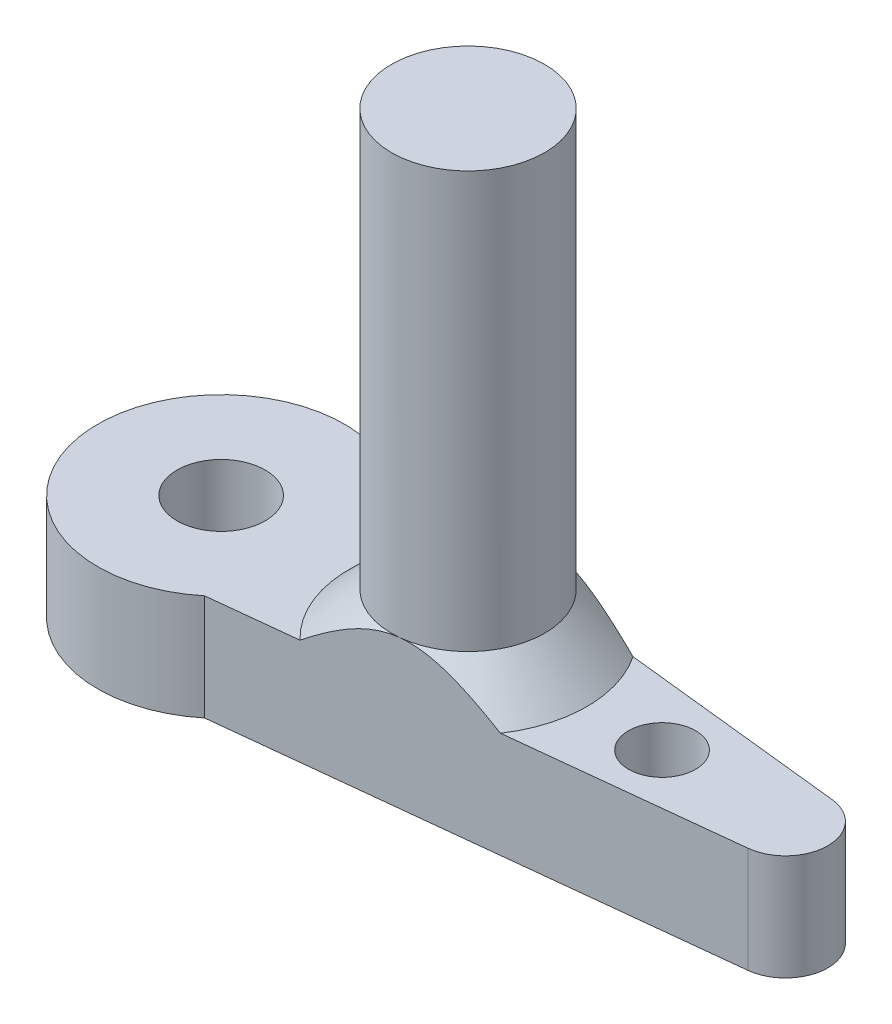
ISO-10303-21;
HEADER;
FILE_DESCRIPTION(('STEP AP214'),'2;1');
FILE_NAME('part.step','',(''),(''),'','','');
FILE_SCHEMA(('AUTOMOTIVE_DESIGN { 1 0 10303 214 1 1 1 1 }'));
ENDSEC;
DATA;
#1=APPLICATION_CONTEXT('core data for automotive mechanical design processes');
#2=APPLICATION_PROTOCOL_DEFINITION('international standard','automotive_design',2000,#1);
#3=PRODUCT_CONTEXT('',#1,'mechanical');
#4=PRODUCT('Part','Part','',(#3));
#5=PRODUCT_RELATED_PRODUCT_CATEGORY('part','',(#4));
#6=PRODUCT_DEFINITION_FORMATION('','',#4);
#7=PRODUCT_DEFINITION_CONTEXT('part definition',#1,'design');
#8=PRODUCT_DEFINITION('design','',#6,#7);
#9=PRODUCT_DEFINITION_SHAPE('','',#8);
#10=(LENGTH_UNIT() NAMED_UNIT(*) SI_UNIT(.MILLI.,.METRE.));
#11=(NAMED_UNIT(*) PLANE_ANGLE_UNIT() SI_UNIT($,.RADIAN.));
#12=(NAMED_UNIT(*) SI_UNIT($,.STERADIAN.) SOLID_ANGLE_UNIT());
#13=UNCERTAINTY_MEASURE_WITH_UNIT(LENGTH_MEASURE(1.E-05),#10,'distance_accuracy_value','');
#14=(GEOMETRIC_REPRESENTATION_CONTEXT(3) GLOBAL_UNCERTAINTY_ASSIGNED_CONTEXT((#13)) GLOBAL_UNIT_ASSIGNED_CONTEXT((#10,
#11,#12)) REPRESENTATION_CONTEXT('',''));
#15=CARTESIAN_POINT('',(0.,0.,0.));
#16=DIRECTION('',(0.,0.,1.));
#17=DIRECTION('',(1.,0.,0.));
#18=AXIS2_PLACEMENT_3D('',#15,#16,#17);
#19=CARTESIAN_POINT('',(0.,3.,0.));
#20=DIRECTION('',(0.,1.,0.));
#21=DIRECTION('',(0.,0.,1.));
#22=AXIS2_PLACEMENT_3D('',#19,#20,#21);
#23=PLANE('',#22);
#24=DIRECTION('',(0.994176084488916,0.,0.107767866408722));
#25=VECTOR('',#24,1.);
#26=CARTESIAN_POINT('',(0.315144048175078,3.,-2.90725506874587));
#27=LINE('',#26,#25);
#28=CARTESIAN_POINT('',(9.79716074364351,3.,-1.87941229072548));
#29=VERTEX_POINT('',#28);
#30=CARTESIAN_POINT('',(16.1293214396905,3.,-1.1930113013867));
#31=VERTEX_POINT('',#30);
#32=EDGE_CURVE('E227',#29,#31,#27,.T.);
#33=ORIENTED_EDGE('',*,*,#32,.F.);
#34=CARTESIAN_POINT('',(7.,3.,0.));
#35=DIRECTION('',(0.,1.,0.));
#36=DIRECTION('',(0.,0.,1.));
#37=AXIS2_PLACEMENT_3D('',#34,#35,#36);
#38=CIRCLE('',#37,3.36991079767852);
#39=CARTESIAN_POINT('',(9.7971607436435,3.,1.87941229072548));
#40=VERTEX_POINT('',#39);
#41=EDGE_CURVE('E136',#29,#40,#38,.F.);
#42=ORIENTED_EDGE('',*,*,#41,.T.);
#43=DIRECTION('',(0.994176084488916,0.,-0.107767866408722));
#44=VECTOR('',#43,1.);
#45=CARTESIAN_POINT('',(0.315144048175078,3.,2.90725506874587));
#46=LINE('',#45,#44);
#47=CARTESIAN_POINT('',(16.1293214396905,3.,1.1930113013867));
#48=VERTEX_POINT('',#47);
#49=EDGE_CURVE('E110',#40,#48,#46,.T.);
#50=ORIENTED_EDGE('',*,*,#49,.T.);
#51=CARTESIAN_POINT('',(16.,3.,0.));
#52=DIRECTION('',(0.,1.,0.));
#53=DIRECTION('',(0.,0.,1.));
#54=AXIS2_PLACEMENT_3D('',#51,#52,#53);
#55=CIRCLE('',#54,1.2);
#56=EDGE_CURVE('E109',#48,#31,#55,.T.);
#57=ORIENTED_EDGE('',*,*,#56,.T.);
#58=EDGE_LOOP('',(#33,#42,#50,#57));
#59=FACE_BOUND('',#58,.T.);
#60=CARTESIAN_POINT('',(12.5,3.,0.));
#61=DIRECTION('',(0.,1.,0.));
#62=DIRECTION('',(0.,0.,1.));
#63=AXIS2_PLACEMENT_3D('',#60,#61,#62);
#64=CIRCLE('',#63,0.949999999999999);
#65=CARTESIAN_POINT('',(12.5,3.,0.949999999999999));
#66=VERTEX_POINT('',#65);
#67=EDGE_CURVE('E224',#66,#66,#64,.F.);
#68=ORIENTED_EDGE('',*,*,#67,.T.);
#69=EDGE_LOOP('',(#68));
#70=FACE_BOUND('',#69,.T.);
#71=ADVANCED_FACE('F36',(#59,#70),#23,.T.);
#72=CARTESIAN_POINT('',(0.,3.,0.));
#73=DIRECTION('',(0.,-1.,0.));
#74=DIRECTION('',(0.,0.,-1.));
#75=AXIS2_PLACEMENT_3D('',#72,#73,#74);
#76=CYLINDRICAL_SURFACE('',#75,3.5);
#77=CARTESIAN_POINT('',(0.,0.,0.));
#78=DIRECTION('',(0.,1.,0.));
#79=DIRECTION('',(0.,0.,1.));
#80=AXIS2_PLACEMENT_3D('',#77,#78,#79);
#81=CIRCLE('',#80,3.5);
#82=CARTESIAN_POINT('',(2.22710574513201,0.,-2.7));
#83=VERTEX_POINT('',#82);
#84=CARTESIAN_POINT('',(2.22710574513201,0.,2.7));
#85=VERTEX_POINT('',#84);
#86=EDGE_CURVE('E123',#83,#85,#81,.T.);
#87=ORIENTED_EDGE('',*,*,#86,.T.);
#88=DIRECTION('',(0.,-1.,0.));
#89=VECTOR('',#88,1.);
#90=CARTESIAN_POINT('',(2.22710574513201,3.,2.7));
#91=LINE('',#90,#89);
#92=CARTESIAN_POINT('',(2.22710574513201,3.,2.7));
#93=VERTEX_POINT('',#92);
#94=EDGE_CURVE('E104',#93,#85,#91,.T.);
#95=ORIENTED_EDGE('',*,*,#94,.F.);
#96=CARTESIAN_POINT('',(0.,3.,0.));
#97=DIRECTION('',(0.,1.,0.));
#98=DIRECTION('',(0.,0.,1.));
#99=AXIS2_PLACEMENT_3D('',#96,#97,#98);
#100=CIRCLE('',#99,3.5);
#101=CARTESIAN_POINT('',(2.22710574513201,3.,-2.7));
#102=VERTEX_POINT('',#101);
#103=EDGE_CURVE('E114',#102,#93,#100,.T.);
#104=ORIENTED_EDGE('',*,*,#103,.F.);
#105=DIRECTION('',(0.,-1.,0.));
#106=VECTOR('',#105,1.);
#107=CARTESIAN_POINT('',(2.22710574513201,3.,-2.7));
#108=LINE('',#107,#106);
#109=EDGE_CURVE('E223',#102,#83,#108,.T.);
#110=ORIENTED_EDGE('',*,*,#109,.T.);
#111=EDGE_LOOP('',(#87,#95,#104,#110));
#112=FACE_BOUND('',#111,.T.);
#113=ADVANCED_FACE('F121',(#112),#76,.T.);
#114=CARTESIAN_POINT('',(0.315144048175078,3.,2.90725506874587));
#115=DIRECTION('',(-0.107767866408722,0.,-0.994176084488916));
#116=DIRECTION('',(-0.994176084488916,0.,0.107767866408722));
#117=AXIS2_PLACEMENT_3D('',#114,#115,#116);
#118=PLANE('',#117);
#119=DIRECTION('',(0.994176084488916,0.,-0.107767866408722));
#120=VECTOR('',#119,1.);
#121=CARTESIAN_POINT('',(0.315144048175078,0.,2.90725506874587));
#122=LINE('',#121,#120);
#123=CARTESIAN_POINT('',(16.1293214396905,0.,1.1930113013867));
#124=VERTEX_POINT('',#123);
#125=EDGE_CURVE('E232',#85,#124,#122,.T.);
#126=ORIENTED_EDGE('',*,*,#125,.T.);
#127=DIRECTION('',(0.,-1.,0.));
#128=VECTOR('',#127,1.);
#129=CARTESIAN_POINT('',(16.1293214396905,3.,1.1930113013867));
#130=LINE('',#129,#128);
#131=EDGE_CURVE('E125',#48,#124,#130,.T.);
#132=ORIENTED_EDGE('',*,*,#131,.F.);
#133=ORIENTED_EDGE('',*,*,#49,.F.);
#134=CARTESIAN_POINT('',(9.7971607436435,3.,1.87941229072548));
#135=CARTESIAN_POINT('',(9.73051084428461,3.05127818302609,1.88663708476582));
#136=CARTESIAN_POINT('',(9.66347187646432,3.10205452684511,1.89390405350602));
#137=CARTESIAN_POINT('',(9.52843979144314,3.20235423631394,1.90854141999119));
#138=CARTESIAN_POINT('',(9.46044635780364,3.25187717039671,1.91591185203784));
#139=CARTESIAN_POINT('',(9.3227804034229,3.3498081105817,1.93083472778612));
#140=CARTESIAN_POINT('',(9.25309843745192,3.39820273344837,1.93838819534284));
#141=CARTESIAN_POINT('',(9.11244364364383,3.49304615808316,1.95363505881638));
#142=CARTESIAN_POINT('',(9.04147095867485,3.53949517335074,1.9613284392464));
#143=CARTESIAN_POINT('',(8.90119386504663,3.62795142871201,1.9765343603324));
#144=CARTESIAN_POINT('',(8.83195561014722,3.67006433704469,1.98403972997546));
#145=CARTESIAN_POINT('',(8.69185924029102,3.75151718674486,1.99922606075384));
#146=CARTESIAN_POINT('',(8.62100084900587,3.79085665033398,2.00690705184294));
#147=CARTESIAN_POINT('',(8.47767951877178,3.86590665813953,2.0224429656626));
#148=CARTESIAN_POINT('',(8.40522235299904,3.90162826907575,2.03029726258563));
#149=CARTESIAN_POINT('',(8.25831941379219,3.96864927061285,2.04622141985968));
#150=CARTESIAN_POINT('',(8.18387430252709,3.9999501124181,2.05429120843211));
#151=CARTESIAN_POINT('',(8.03917762053841,4.05462800734259,2.06997620924599));
#152=CARTESIAN_POINT('',(7.96909329562954,4.07844791939142,2.07757329217924));
#153=CARTESIAN_POINT('',(7.82728876713143,4.12042558908607,2.09294478594354));
#154=CARTESIAN_POINT('',(7.75556948029315,4.13858643994764,2.10071909739954));
#155=CARTESIAN_POINT('',(7.60938298844534,4.16856281425596,2.11656559237162));
#156=CARTESIAN_POINT('',(7.53488946915538,4.18025235372775,2.12464062833397));
#157=CARTESIAN_POINT('',(7.4224594645857,4.19204734183073,2.13682794796661));
#158=CARTESIAN_POINT('',(7.38480596152707,4.19502259226955,2.14090955659787));
#159=CARTESIAN_POINT('',(7.3093863267108,4.19900148384175,2.14908498271834));
#160=CARTESIAN_POINT('',(7.2716201674462,4.20000459579655,2.15317880318928));
#161=CARTESIAN_POINT('',(7.23384665696306,4.20000000000003,2.15727342052623));
#162=B_SPLINE_CURVE_WITH_KNOTS('',3,(#134,#135,#136,#137,#138,#139,#140,#141,#142,#143,#144,
#145,#146,#147,#148,#149,#150,#151,#152,#153,#154,#155,#156,#157,#158,#159,#160,#161),
.UNSPECIFIED.,.F.,.F.,(4,2,2,2,2,2,2,2,2,2,2,2,2,4),(0.,0.253215369662458,0.506516770545243,
0.762013553410774,1.01748222572744,1.26159087837537,1.50574148112112,1.7491211340151,
1.99242070612637,2.21545338524078,2.4383639410476,2.66547387463038,2.77940048900283,
2.8933576688247),.UNSPECIFIED.);
#163=CARTESIAN_POINT('',(7.23384665696306,4.20000000000003,2.15727342052623));
#164=VERTEX_POINT('',#163);
#165=EDGE_CURVE('E58',#40,#164,#162,.T.);
#166=ORIENTED_EDGE('',*,*,#165,.T.);
#167=CARTESIAN_POINT('',(7.23384665696306,4.20000000000003,2.15727342052623));
#168=CARTESIAN_POINT('',(7.16751936442533,4.20005591111395,2.16446324425362));
#169=CARTESIAN_POINT('',(7.10122645165771,4.19692446414047,2.17164934124232));
#170=CARTESIAN_POINT('',(6.96931452393369,4.18472841512932,2.1859484852536));
#171=CARTESIAN_POINT('',(6.90369440088901,4.17567606618651,2.19306165239204));
#172=CARTESIAN_POINT('',(6.7745196879764,4.15226924836292,2.20706408457859));
#173=CARTESIAN_POINT('',(6.71094886754045,4.1380038302185,2.21395510900688));
#174=CARTESIAN_POINT('',(6.58501041300813,4.10480265126482,2.22760673345803));
#175=CARTESIAN_POINT('',(6.52264337515933,4.08586463698363,2.23436726884815));
#176=CARTESIAN_POINT('',(6.32546688890222,4.01898032259092,2.25574103709849));
#177=CARTESIAN_POINT('',(6.19320616781267,3.96342490230429,2.27007799002251));
#178=CARTESIAN_POINT('',(5.93473269617393,3.83951214374769,2.29809630085935));
#179=CARTESIAN_POINT('',(5.80853194481715,3.77113062360386,2.31177635806963));
#180=CARTESIAN_POINT('',(5.55966217309714,3.62511251177238,2.33875363576755));
#181=CARTESIAN_POINT('',(5.43705027459401,3.54737874900289,2.35204466429274));
#182=CARTESIAN_POINT('',(5.19580463248301,3.38616710450459,2.37819549263827));
#183=CARTESIAN_POINT('',(5.0771678916227,3.30269370231251,2.39105561735831));
#184=CARTESIAN_POINT('',(4.91111302412074,3.18151522696099,2.40905582784081));
#185=CARTESIAN_POINT('',(4.86247549146583,3.14548179292015,2.41432809620793));
#186=CARTESIAN_POINT('',(4.76600463712151,3.07305113138574,2.42478545713777));
#187=CARTESIAN_POINT('',(4.71816805837059,3.03665829545323,2.42997090276326));
#188=CARTESIAN_POINT('',(4.67053257028262,3.,2.43513455032698));
#189=B_SPLINE_CURVE_WITH_KNOTS('',3,(#167,#168,#169,#170,#171,#172,#173,#174,#175,#176,#177,
#178,#179,#180,#181,#182,#183,#184,#185,#186,#187,#188),.UNSPECIFIED.,.F.,.F.,(4,2,2,2,2,2,2,2,
2,2,4),(0.,0.200018701462015,0.399624775490247,0.595969387562023,0.792408877274736,
1.22373633485695,1.65588532845892,2.09299173139195,2.52976078144386,2.71203854185874,
2.89302375850225),.UNSPECIFIED.);
#190=CARTESIAN_POINT('',(4.67053257028262,3.,2.43513455032698));
#191=VERTEX_POINT('',#190);
#192=EDGE_CURVE('E51',#164,#191,#189,.T.);
#193=ORIENTED_EDGE('',*,*,#192,.T.);
#194=EDGE_CURVE('E100',#93,#191,#46,.T.);
#195=ORIENTED_EDGE('',*,*,#194,.F.);
#196=ORIENTED_EDGE('',*,*,#94,.T.);
#197=EDGE_LOOP('',(#126,#132,#133,#166,#193,#195,#196));
#198=FACE_BOUND('',#197,.T.);
#199=ADVANCED_FACE('F102',(#198),#118,.F.);
#200=CARTESIAN_POINT('',(16.,3.,0.));
#201=DIRECTION('',(0.,-1.,0.));
#202=DIRECTION('',(0.,0.,-1.));
#203=AXIS2_PLACEMENT_3D('',#200,#201,#202);
#204=CYLINDRICAL_SURFACE('',#203,1.2);
#205=CARTESIAN_POINT('',(16.,0.,0.));
#206=DIRECTION('',(0.,1.,0.));
#207=DIRECTION('',(0.,0.,1.));
#208=AXIS2_PLACEMENT_3D('',#205,#206,#207);
#209=CIRCLE('',#208,1.2);
#210=CARTESIAN_POINT('',(16.1293214396905,0.,-1.1930113013867));
#211=VERTEX_POINT('',#210);
#212=EDGE_CURVE('E219',#124,#211,#209,.T.);
#213=ORIENTED_EDGE('',*,*,#212,.T.);
#214=DIRECTION('',(0.,-1.,0.));
#215=VECTOR('',#214,1.);
#216=CARTESIAN_POINT('',(16.1293214396905,3.,-1.1930113013867));
#217=LINE('',#216,#215);
#218=EDGE_CURVE('E130',#31,#211,#217,.T.);
#219=ORIENTED_EDGE('',*,*,#218,.F.);
#220=ORIENTED_EDGE('',*,*,#56,.F.);
#221=ORIENTED_EDGE('',*,*,#131,.T.);
#222=EDGE_LOOP('',(#213,#219,#220,#221));
#223=FACE_BOUND('',#222,.T.);
#224=ADVANCED_FACE('F162',(#223),#204,.T.);
#225=CARTESIAN_POINT('',(0.315144048175078,3.,-2.90725506874587));
#226=DIRECTION('',(0.107767866408722,0.,-0.994176084488916));
#227=DIRECTION('',(-0.994176084488916,0.,-0.107767866408722));
#228=AXIS2_PLACEMENT_3D('',#225,#226,#227);
#229=PLANE('',#228);
#230=DIRECTION('',(0.994176084488916,0.,0.107767866408722));
#231=VECTOR('',#230,1.);
#232=CARTESIAN_POINT('',(0.315144048175078,0.,-2.90725506874587));
#233=LINE('',#232,#231);
#234=EDGE_CURVE('E216',#83,#211,#233,.T.);
#235=ORIENTED_EDGE('',*,*,#234,.F.);
#236=ORIENTED_EDGE('',*,*,#109,.F.);
#237=CARTESIAN_POINT('',(4.67053257028262,3.,-2.43513455032698));
#238=VERTEX_POINT('',#237);
#239=EDGE_CURVE('E117',#102,#238,#27,.T.);
#240=ORIENTED_EDGE('',*,*,#239,.T.);
#241=CARTESIAN_POINT('',(4.67053257028262,3.,-2.43513455032698));
#242=CARTESIAN_POINT('',(4.73718246964151,3.05127818302609,-2.42790975628664));
#243=CARTESIAN_POINT('',(4.8042214374618,3.10205452684511,-2.42064278754644));
#244=CARTESIAN_POINT('',(4.93925352248298,3.20235423631394,-2.40600542106127));
#245=CARTESIAN_POINT('',(5.00724695612248,3.25187717039671,-2.39863498901462));
#246=CARTESIAN_POINT('',(5.14491291050322,3.3498081105817,-2.38371211326635));
#247=CARTESIAN_POINT('',(5.2145948764742,3.39820273344836,-2.37615864570962));
#248=CARTESIAN_POINT('',(5.35524967028229,3.49304615808316,-2.36091178223609));
#249=CARTESIAN_POINT('',(5.42622235525127,3.53949517335074,-2.35321840180606));
#250=CARTESIAN_POINT('',(5.56649944887949,3.62795142871201,-2.33801248072006));
#251=CARTESIAN_POINT('',(5.6357377037789,3.67006433704469,-2.33050711107701));
#252=CARTESIAN_POINT('',(5.77583407363511,3.75151718674486,-2.31532078029862));
#253=CARTESIAN_POINT('',(5.84669246492025,3.79085665033398,-2.30763978920952));
#254=CARTESIAN_POINT('',(5.99001379515435,3.86590665813954,-2.29210387538986));
#255=CARTESIAN_POINT('',(6.06247096092708,3.90162826907575,-2.28424957846683));
#256=CARTESIAN_POINT('',(6.20937390013394,3.96864927061285,-2.26832542119279));
#257=CARTESIAN_POINT('',(6.28381901139903,3.9999501124181,-2.26025563262035));
#258=CARTESIAN_POINT('',(6.42851569338772,4.05462800734259,-2.24457063180648));
#259=CARTESIAN_POINT('',(6.49860001829658,4.07844791939142,-2.23697354887322));
#260=CARTESIAN_POINT('',(6.64040454679469,4.12042558908607,-2.22160205510892));
#261=CARTESIAN_POINT('',(6.71212383363297,4.13858643994764,-2.21382774365293));
#262=CARTESIAN_POINT('',(6.85831032548078,4.16856281425596,-2.19798124868085));
#263=CARTESIAN_POINT('',(6.93280384477074,4.18025235372775,-2.1899062127185));
#264=CARTESIAN_POINT('',(7.04523384934043,4.19204734183073,-2.17771889308585));
#265=CARTESIAN_POINT('',(7.08288735239905,4.19502259226955,-2.17363728445459));
#266=CARTESIAN_POINT('',(7.15830698721532,4.19900148384175,-2.16546185833413));
#267=CARTESIAN_POINT('',(7.19607314647992,4.20000459579655,-2.16136803786319));
#268=CARTESIAN_POINT('',(7.23384665696306,4.20000000000003,-2.15727342052623));
#269=B_SPLINE_CURVE_WITH_KNOTS('',3,(#241,#242,#243,#244,#245,#246,#247,#248,#249,#250,#251,
#252,#253,#254,#255,#256,#257,#258,#259,#260,#261,#262,#263,#264,#265,#266,#267,#268),
.UNSPECIFIED.,.F.,.F.,(4,2,2,2,2,2,2,2,2,2,2,2,2,4),(0.,0.253215369662455,0.506516770545241,
0.762013553410772,1.01748222572744,1.26159087837537,1.50574148112113,1.74912113401511,
1.99242070612638,2.21545338524078,2.4383639410476,2.66547387463038,2.77940048900283,
2.8933576688247),.UNSPECIFIED.);
#270=CARTESIAN_POINT('',(7.23384665696306,4.20000000000003,-2.15727342052623));
#271=VERTEX_POINT('',#270);
#272=EDGE_CURVE('E11',#238,#271,#269,.T.);
#273=ORIENTED_EDGE('',*,*,#272,.T.);
#274=CARTESIAN_POINT('',(7.23384665696306,4.20000000000003,-2.15727342052623));
#275=CARTESIAN_POINT('',(7.30017394950079,4.20005591111395,-2.15008359679885));
#276=CARTESIAN_POINT('',(7.36646686226841,4.19692446414047,-2.14289749981014));
#277=CARTESIAN_POINT('',(7.49837878999243,4.18472841512932,-2.12859835579886));
#278=CARTESIAN_POINT('',(7.56399891303711,4.17567606618651,-2.12148518866043));
#279=CARTESIAN_POINT('',(7.69317362594972,4.15226924836292,-2.10748275647387));
#280=CARTESIAN_POINT('',(7.75674444638567,4.1380038302185,-2.10059173204558));
#281=CARTESIAN_POINT('',(7.88268290091799,4.10480265126482,-2.08694010759443));
#282=CARTESIAN_POINT('',(7.94504993876679,4.08586463698363,-2.08017957220431));
#283=CARTESIAN_POINT('',(8.1422264250239,4.01898032259093,-2.05880580395397));
#284=CARTESIAN_POINT('',(8.27448714611345,3.9634249023043,-2.04446885102996));
#285=CARTESIAN_POINT('',(8.53296061775218,3.83951214374769,-2.01645054019312));
#286=CARTESIAN_POINT('',(8.65916136910897,3.77113062360386,-2.00277048298284));
#287=CARTESIAN_POINT('',(8.90803114082897,3.62511251177238,-1.97579320528492));
#288=CARTESIAN_POINT('',(9.03064303933211,3.5473787490029,-1.96250217675972));
#289=CARTESIAN_POINT('',(9.27188868144311,3.38616710450459,-1.93635134841419));
#290=CARTESIAN_POINT('',(9.39052542230342,3.30269370231251,-1.92349122369416));
#291=CARTESIAN_POINT('',(9.55658028980538,3.181515226961,-1.90549101321166));
#292=CARTESIAN_POINT('',(9.60521782246029,3.14548179292015,-1.90021874484453));
#293=CARTESIAN_POINT('',(9.70168867680461,3.07305113138574,-1.88976138391469));
#294=CARTESIAN_POINT('',(9.74952525555553,3.03665829545323,-1.8845759382892));
#295=CARTESIAN_POINT('',(9.79716074364351,3.,-1.87941229072548));
#296=B_SPLINE_CURVE_WITH_KNOTS('',3,(#274,#275,#276,#277,#278,#279,#280,#281,#282,#283,#284,
#285,#286,#287,#288,#289,#290,#291,#292,#293,#294,#295),.UNSPECIFIED.,.F.,.F.,(4,2,2,2,2,2,2,2,
2,2,4),(0.,0.200018701462016,0.399624775490247,0.595969387562021,0.792408877274736,
1.22373633485695,1.65588532845892,2.09299173139195,2.52976078144386,2.71203854185873,
2.89302375850225),.UNSPECIFIED.);
#297=EDGE_CURVE('E141',#271,#29,#296,.T.);
#298=ORIENTED_EDGE('',*,*,#297,.T.);
#299=ORIENTED_EDGE('',*,*,#32,.T.);
#300=ORIENTED_EDGE('',*,*,#218,.T.);
#301=EDGE_LOOP('',(#235,#236,#240,#273,#298,#299,#300));
#302=FACE_BOUND('',#301,.T.);
#303=ADVANCED_FACE('F156',(#302),#229,.T.);
#304=CARTESIAN_POINT('',(0.,3.,0.));
#305=DIRECTION('',(0.,-1.,0.));
#306=DIRECTION('',(0.,0.,-1.));
#307=AXIS2_PLACEMENT_3D('',#304,#305,#306);
#308=CYLINDRICAL_SURFACE('',#307,1.25);
#309=CARTESIAN_POINT('',(0.,3.,0.));
#310=DIRECTION('',(0.,1.,0.));
#311=DIRECTION('',(0.,0.,1.));
#312=AXIS2_PLACEMENT_3D('',#309,#310,#311);
#313=CIRCLE('',#312,1.25);
#314=CARTESIAN_POINT('',(0.,3.,1.25));
#315=VERTEX_POINT('',#314);
#316=EDGE_CURVE('E119',#315,#315,#313,.T.);
#317=ORIENTED_EDGE('',*,*,#316,.T.);
#318=EDGE_LOOP('',(#317));
#319=FACE_BOUND('',#318,.T.);
#320=CARTESIAN_POINT('',(0.,0.,0.));
#321=DIRECTION('',(0.,1.,0.));
#322=DIRECTION('',(0.,0.,1.));
#323=AXIS2_PLACEMENT_3D('',#320,#321,#322);
#324=CIRCLE('',#323,1.25);
#325=CARTESIAN_POINT('',(0.,0.,1.25));
#326=VERTEX_POINT('',#325);
#327=EDGE_CURVE('E208',#326,#326,#324,.T.);
#328=ORIENTED_EDGE('',*,*,#327,.F.);
#329=EDGE_LOOP('',(#328));
#330=FACE_BOUND('',#329,.T.);
#331=ADVANCED_FACE('F161',(#319,#330),#308,.F.);
#332=CARTESIAN_POINT('',(12.5,3.,0.));
#333=DIRECTION('',(0.,-1.,0.));
#334=DIRECTION('',(0.,0.,-1.));
#335=AXIS2_PLACEMENT_3D('',#332,#333,#334);
#336=CYLINDRICAL_SURFACE('',#335,0.949999999999999);
#337=ORIENTED_EDGE('',*,*,#67,.F.);
#338=EDGE_LOOP('',(#337));
#339=FACE_BOUND('',#338,.T.);
#340=CARTESIAN_POINT('',(12.5,0.,0.));
#341=DIRECTION('',(0.,1.,0.));
#342=DIRECTION('',(0.,0.,1.));
#343=AXIS2_PLACEMENT_3D('',#340,#341,#342);
#344=CIRCLE('',#343,0.949999999999999);
#345=CARTESIAN_POINT('',(12.5,0.,0.949999999999999));
#346=VERTEX_POINT('',#345);
#347=EDGE_CURVE('E214',#346,#346,#344,.F.);
#348=ORIENTED_EDGE('',*,*,#347,.T.);
#349=EDGE_LOOP('',(#348));
#350=FACE_BOUND('',#349,.T.);
#351=ADVANCED_FACE('F163',(#339,#350),#336,.F.);
#352=ORIENTED_EDGE('',*,*,#194,.T.);
#353=CARTESIAN_POINT('',(7.,3.,0.));
#354=DIRECTION('',(0.,1.,0.));
#355=DIRECTION('',(0.,0.,1.));
#356=AXIS2_PLACEMENT_3D('',#353,#354,#355);
#357=CIRCLE('',#356,3.36991079767852);
#358=EDGE_CURVE('E139',#191,#238,#357,.F.);
#359=ORIENTED_EDGE('',*,*,#358,.T.);
#360=ORIENTED_EDGE('',*,*,#239,.F.);
#361=ORIENTED_EDGE('',*,*,#103,.T.);
#362=EDGE_LOOP('',(#352,#359,#360,#361));
#363=FACE_BOUND('',#362,.T.);
#364=ORIENTED_EDGE('',*,*,#316,.F.);
#365=EDGE_LOOP('',(#364));
#366=FACE_BOUND('',#365,.T.);
#367=ADVANCED_FACE('F115',(#363,#366),#23,.T.);
#368=CARTESIAN_POINT('',(0.,0.,0.));
#369=DIRECTION('',(0.,1.,0.));
#370=DIRECTION('',(0.,0.,1.));
#371=AXIS2_PLACEMENT_3D('',#368,#369,#370);
#372=PLANE('',#371);
#373=ORIENTED_EDGE('',*,*,#327,.T.);
#374=EDGE_LOOP('',(#373));
#375=FACE_BOUND('',#374,.T.);
#376=ORIENTED_EDGE('',*,*,#86,.F.);
#377=ORIENTED_EDGE('',*,*,#234,.T.);
#378=ORIENTED_EDGE('',*,*,#212,.F.);
#379=ORIENTED_EDGE('',*,*,#125,.F.);
#380=EDGE_LOOP('',(#376,#377,#378,#379));
#381=FACE_BOUND('',#380,.T.);
#382=ORIENTED_EDGE('',*,*,#347,.F.);
#383=EDGE_LOOP('',(#382));
#384=FACE_BOUND('',#383,.T.);
#385=ADVANCED_FACE('F194',(#375,#381,#384),#372,.F.);
#386=CARTESIAN_POINT('',(7.,16.,0.));
#387=DIRECTION('',(0.,-1.,0.));
#388=DIRECTION('',(0.,0.,-1.));
#389=AXIS2_PLACEMENT_3D('',#386,#387,#388);
#390=CYLINDRICAL_SURFACE('',#389,2.1699107976785);
#391=CARTESIAN_POINT('',(7.,4.20000000000003,0.));
#392=DIRECTION('',(0.,1.,0.));
#393=DIRECTION('',(0.,0.,1.));
#394=AXIS2_PLACEMENT_3D('',#391,#392,#393);
#395=CIRCLE('',#394,2.1699107976785);
#396=EDGE_CURVE('E124',#271,#164,#395,.T.);
#397=ORIENTED_EDGE('',*,*,#396,.T.);
#398=CARTESIAN_POINT('',(7.,4.20000000000003,0.));
#399=DIRECTION('',(0.,1.,0.));
#400=DIRECTION('',(0.,0.,1.));
#401=AXIS2_PLACEMENT_3D('',#398,#399,#400);
#402=CIRCLE('',#401,2.1699107976785);
#403=EDGE_CURVE('E127',#164,#271,#402,.T.);
#404=ORIENTED_EDGE('',*,*,#403,.T.);
#405=EDGE_LOOP('',(#397,#404));
#406=FACE_BOUND('',#405,.T.);
#407=CARTESIAN_POINT('',(7.,16.,0.));
#408=DIRECTION('',(0.,1.,0.));
#409=DIRECTION('',(0.,0.,1.));
#410=AXIS2_PLACEMENT_3D('',#407,#408,#409);
#411=CIRCLE('',#410,2.1699107976785);
#412=CARTESIAN_POINT('',(7.,16.,2.1699107976785));
#413=VERTEX_POINT('',#412);
#414=EDGE_CURVE('E237',#413,#413,#411,.T.);
#415=ORIENTED_EDGE('',*,*,#414,.F.);
#416=EDGE_LOOP('',(#415));
#417=FACE_BOUND('',#416,.T.);
#418=ADVANCED_FACE('F198',(#406,#417),#390,.T.);
#419=CARTESIAN_POINT('',(7.,16.,0.));
#420=DIRECTION('',(0.,1.,0.));
#421=DIRECTION('',(0.,0.,1.));
#422=AXIS2_PLACEMENT_3D('',#419,#420,#421);
#423=PLANE('',#422);
#424=ORIENTED_EDGE('',*,*,#414,.T.);
#425=EDGE_LOOP('',(#424));
#426=FACE_BOUND('',#425,.T.);
#427=ADVANCED_FACE('F203',(#426),#423,.T.);
#428=CARTESIAN_POINT('',(7.,4.20000000000003,0.));
#429=DIRECTION('',(0.,-1.,0.));
#430=DIRECTION('',(0.,0.,-1.));
#431=AXIS2_PLACEMENT_3D('',#428,#429,#430);
#432=CONICAL_SURFACE('',#431,2.1699107976785,0.785398163397443);
#433=ORIENTED_EDGE('',*,*,#358,.F.);
#434=ORIENTED_EDGE('',*,*,#192,.F.);
#435=ORIENTED_EDGE('',*,*,#396,.F.);
#436=ORIENTED_EDGE('',*,*,#272,.F.);
#437=EDGE_LOOP('',(#433,#434,#435,#436));
#438=FACE_BOUND('',#437,.T.);
#439=ADVANCED_FACE('F39',(#438),#432,.T.);
#440=CARTESIAN_POINT('',(7.,4.20000000000003,0.));
#441=DIRECTION('',(0.,-1.,0.));
#442=DIRECTION('',(0.,0.,-1.));
#443=AXIS2_PLACEMENT_3D('',#440,#441,#442);
#444=CONICAL_SURFACE('',#443,2.1699107976785,0.785398163397443);
#445=ORIENTED_EDGE('',*,*,#165,.F.);
#446=ORIENTED_EDGE('',*,*,#41,.F.);
#447=ORIENTED_EDGE('',*,*,#297,.F.);
#448=ORIENTED_EDGE('',*,*,#403,.F.);
#449=EDGE_LOOP('',(#445,#446,#447,#448));
#450=FACE_BOUND('',#449,.T.);
#451=ADVANCED_FACE('F153',(#450),#444,.T.);
#452=CLOSED_SHELL('',(#71,#113,#199,#224,#303,#331,#351,#367,#385,#418,#427,#439,#451));
#453=MANIFOLD_SOLID_BREP('B2',#452);
#454=ADVANCED_BREP_SHAPE_REPRESENTATION('',(#18,#453),#14);
#455=SHAPE_DEFINITION_REPRESENTATION(#9,#454);
ENDSEC;
END-ISO-10303-21;
